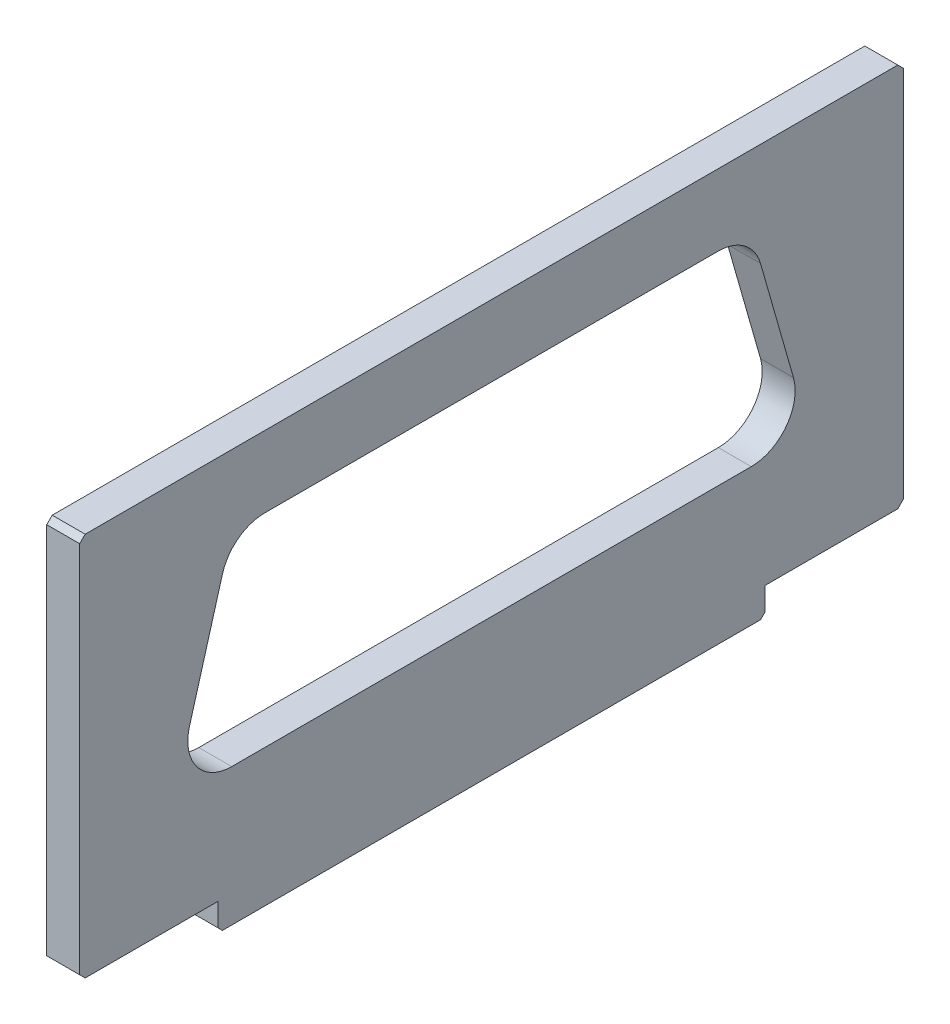
ISO-10303-21;
HEADER;
FILE_DESCRIPTION(('STEP AP214'),'2;1');
FILE_NAME('part.step','',(''),(''),'','','');
FILE_SCHEMA(('AUTOMOTIVE_DESIGN { 1 0 10303 214 1 1 1 1 }'));
ENDSEC;
DATA;
#1=APPLICATION_CONTEXT('core data for automotive mechanical design processes');
#2=APPLICATION_PROTOCOL_DEFINITION('international standard','automotive_design',2000,#1);
#3=PRODUCT_CONTEXT('',#1,'mechanical');
#4=PRODUCT('Part','Part','',(#3));
#5=PRODUCT_RELATED_PRODUCT_CATEGORY('part','',(#4));
#6=PRODUCT_DEFINITION_FORMATION('','',#4);
#7=PRODUCT_DEFINITION_CONTEXT('part definition',#1,'design');
#8=PRODUCT_DEFINITION('design','',#6,#7);
#9=PRODUCT_DEFINITION_SHAPE('','',#8);
#10=(LENGTH_UNIT() NAMED_UNIT(*) SI_UNIT(.MILLI.,.METRE.));
#11=(NAMED_UNIT(*) PLANE_ANGLE_UNIT() SI_UNIT($,.RADIAN.));
#12=(NAMED_UNIT(*) SI_UNIT($,.STERADIAN.) SOLID_ANGLE_UNIT());
#13=UNCERTAINTY_MEASURE_WITH_UNIT(LENGTH_MEASURE(1.E-05),#10,'distance_accuracy_value','');
#14=(GEOMETRIC_REPRESENTATION_CONTEXT(3) GLOBAL_UNCERTAINTY_ASSIGNED_CONTEXT((#13)) GLOBAL_UNIT_ASSIGNED_CONTEXT((#10,
#11,#12)) REPRESENTATION_CONTEXT('',''));
#15=CARTESIAN_POINT('',(0.,0.,0.));
#16=DIRECTION('',(0.,0.,1.));
#17=DIRECTION('',(1.,0.,0.));
#18=AXIS2_PLACEMENT_3D('',#15,#16,#17);
#19=CARTESIAN_POINT('',(78.7009618943231,-37.5,-139.21406460551));
#20=DIRECTION('',(0.,0.,1.));
#21=DIRECTION('',(1.,0.,0.));
#22=AXIS2_PLACEMENT_3D('',#19,#20,#21);
#23=PLANE('',#22);
#24=DIRECTION('',(0.,1.,0.));
#25=VECTOR('',#24,1.);
#26=CARTESIAN_POINT('',(81.7009618943231,-37.5,-139.21406460551));
#27=LINE('',#26,#25);
#28=CARTESIAN_POINT('',(81.7009618943231,-37.1,-139.21406460551));
#29=VERTEX_POINT('',#28);
#30=CARTESIAN_POINT('',(81.7009618943211,-35.,-139.21406460551));
#31=VERTEX_POINT('',#30);
#32=EDGE_CURVE('E377',#29,#31,#27,.T.);
#33=ORIENTED_EDGE('',*,*,#32,.F.);
#34=DIRECTION('',(-1.,0.,0.));
#35=VECTOR('',#34,1.);
#36=CARTESIAN_POINT('',(80.2009618943232,-37.1,-139.21406460551));
#37=LINE('',#36,#35);
#38=CARTESIAN_POINT('',(78.7009618943231,-37.1,-139.21406460551));
#39=VERTEX_POINT('',#38);
#40=EDGE_CURVE('E352',#29,#39,#37,.T.);
#41=ORIENTED_EDGE('',*,*,#40,.T.);
#42=DIRECTION('',(0.,1.,0.));
#43=VECTOR('',#42,1.);
#44=CARTESIAN_POINT('',(78.7009618943231,-37.5,-139.21406460551));
#45=LINE('',#44,#43);
#46=CARTESIAN_POINT('',(78.7009618943225,-35.,-139.21406460551));
#47=VERTEX_POINT('',#46);
#48=EDGE_CURVE('E308',#39,#47,#45,.T.);
#49=ORIENTED_EDGE('',*,*,#48,.T.);
#50=DIRECTION('',(1.,0.,0.));
#51=VECTOR('',#50,1.);
#52=CARTESIAN_POINT('',(78.7009618943231,-35.,-139.21406460551));
#53=LINE('',#52,#51);
#54=EDGE_CURVE('E284',#47,#31,#53,.T.);
#55=ORIENTED_EDGE('',*,*,#54,.T.);
#56=EDGE_LOOP('',(#33,#41,#49,#55));
#57=FACE_BOUND('',#56,.T.);
#58=ADVANCED_FACE('F40',(#57),#23,.F.);
#59=CARTESIAN_POINT('',(81.7009618943231,-37.5,-139.31406460551));
#60=DIRECTION('',(-1.,0.,0.));
#61=DIRECTION('',(0.,0.,1.));
#62=AXIS2_PLACEMENT_3D('',#59,#60,#61);
#63=PLANE('',#62);
#64=DIRECTION('',(0.,0.,1.));
#65=VECTOR('',#64,1.);
#66=CARTESIAN_POINT('',(81.7009618943217,-6.49999999999999,-93.6601603960729));
#67=LINE('',#66,#65);
#68=CARTESIAN_POINT('',(81.7009618943231,-6.49999999999999,-134.967968814943));
#69=VERTEX_POINT('',#68);
#70=CARTESIAN_POINT('',(81.7009618943217,-6.49999999999999,-93.6601603960729));
#71=VERTEX_POINT('',#70);
#72=EDGE_CURVE('E217',#69,#71,#67,.T.);
#73=ORIENTED_EDGE('',*,*,#72,.F.);
#74=CARTESIAN_POINT('',(81.7009618943212,-10.5,-134.967968814946));
#75=DIRECTION('',(1.,0.,0.));
#76=DIRECTION('',(0.,0.,1.));
#77=AXIS2_PLACEMENT_3D('',#74,#75,#76);
#78=CIRCLE('',#77,3.99999999999999);
#79=CARTESIAN_POINT('',(81.7009618943211,-9.40111548841048,-138.81406460551));
#80=VERTEX_POINT('',#79);
#81=EDGE_CURVE('E58',#80,#69,#78,.T.);
#82=ORIENTED_EDGE('',*,*,#81,.F.);
#83=DIRECTION('',(0.,0.961523947640823,0.274721127897377));
#84=VECTOR('',#83,1.);
#85=CARTESIAN_POINT('',(81.7009618943211,-9.40111548841048,-138.81406460551));
#86=LINE('',#85,#84);
#87=CARTESIAN_POINT('',(81.7009618943211,-19.9011154884105,-141.81406460551));
#88=VERTEX_POINT('',#87);
#89=EDGE_CURVE('E205',#88,#80,#86,.T.);
#90=ORIENTED_EDGE('',*,*,#89,.F.);
#91=CARTESIAN_POINT('',(81.7009618943211,-21.,-137.967968814946));
#92=DIRECTION('',(1.,0.,0.));
#93=DIRECTION('',(0.,0.,-1.));
#94=AXIS2_PLACEMENT_3D('',#91,#92,#93);
#95=CIRCLE('',#94,3.99999999999998);
#96=CARTESIAN_POINT('',(81.7009618943211,-25.,-137.967968814946));
#97=VERTEX_POINT('',#96);
#98=EDGE_CURVE('E241',#97,#88,#95,.T.);
#99=ORIENTED_EDGE('',*,*,#98,.F.);
#100=DIRECTION('',(0.,0.,-1.));
#101=VECTOR('',#100,1.);
#102=CARTESIAN_POINT('',(81.7009618943217,-25.,-90.6601603960729));
#103=LINE('',#102,#101);
#104=CARTESIAN_POINT('',(81.7009618943217,-25.,-90.6601603960729));
#105=VERTEX_POINT('',#104);
#106=EDGE_CURVE('E237',#105,#97,#103,.T.);
#107=ORIENTED_EDGE('',*,*,#106,.F.);
#108=CARTESIAN_POINT('',(81.7009618943217,-21.,-90.6601603960729));
#109=DIRECTION('',(1.,0.,0.));
#110=DIRECTION('',(0.,0.,-1.));
#111=AXIS2_PLACEMENT_3D('',#108,#109,#110);
#112=CIRCLE('',#111,4.);
#113=CARTESIAN_POINT('',(81.7009618943218,-19.9011154884105,-86.8140646055096));
#114=VERTEX_POINT('',#113);
#115=EDGE_CURVE('E233',#114,#105,#112,.T.);
#116=ORIENTED_EDGE('',*,*,#115,.F.);
#117=DIRECTION('',(0.,-0.961523947640823,0.274721127897378));
#118=VECTOR('',#117,1.);
#119=CARTESIAN_POINT('',(81.7009618943217,-9.40111548841048,-89.8140646055096));
#120=LINE('',#119,#118);
#121=CARTESIAN_POINT('',(81.7009618943217,-9.40111548841048,-89.8140646055096));
#122=VERTEX_POINT('',#121);
#123=EDGE_CURVE('E229',#122,#114,#120,.T.);
#124=ORIENTED_EDGE('',*,*,#123,.F.);
#125=CARTESIAN_POINT('',(81.7009618943217,-10.5,-93.6601603960729));
#126=DIRECTION('',(1.,0.,0.));
#127=DIRECTION('',(0.,0.,-1.));
#128=AXIS2_PLACEMENT_3D('',#125,#126,#127);
#129=CIRCLE('',#128,4.);
#130=EDGE_CURVE('E225',#71,#122,#129,.T.);
#131=ORIENTED_EDGE('',*,*,#130,.F.);
#132=EDGE_LOOP('',(#73,#82,#90,#99,#107,#116,#124,#131));
#133=FACE_BOUND('',#132,.T.);
#134=DIRECTION('',(0.,1.,0.));
#135=VECTOR('',#134,1.);
#136=CARTESIAN_POINT('',(81.7009618943231,-37.5,-89.4140646055097));
#137=LINE('',#136,#135);
#138=CARTESIAN_POINT('',(81.7009618943231,-37.1,-89.4140646055097));
#139=VERTEX_POINT('',#138);
#140=CARTESIAN_POINT('',(81.7009618943217,-35.,-89.4140646055097));
#141=VERTEX_POINT('',#140);
#142=EDGE_CURVE('E380',#139,#141,#137,.T.);
#143=ORIENTED_EDGE('',*,*,#142,.F.);
#144=DIRECTION('',(0.,0.707106781186546,0.707106781186549));
#145=VECTOR('',#144,1.);
#146=CARTESIAN_POINT('',(81.7009618943231,-37.,-89.3140646055097));
#147=LINE('',#146,#145);
#148=CARTESIAN_POINT('',(81.7009618943231,-37.5,-89.8140646055098));
#149=VERTEX_POINT('',#148);
#150=EDGE_CURVE('E324',#139,#149,#147,.F.);
#151=ORIENTED_EDGE('',*,*,#150,.T.);
#152=DIRECTION('',(0.,0.,1.));
#153=VECTOR('',#152,1.);
#154=CARTESIAN_POINT('',(81.7009618943231,-37.5,-139.31406460551));
#155=LINE('',#154,#153);
#156=CARTESIAN_POINT('',(81.7009618943231,-37.5,-138.81406460551));
#157=VERTEX_POINT('',#156);
#158=EDGE_CURVE('E299',#157,#149,#155,.T.);
#159=ORIENTED_EDGE('',*,*,#158,.F.);
#160=DIRECTION('',(0.,0.707106781186559,-0.707106781186536));
#161=VECTOR('',#160,1.);
#162=CARTESIAN_POINT('',(81.7009618943231,-37.5,-138.81406460551));
#163=LINE('',#162,#161);
#164=EDGE_CURVE('E321',#157,#29,#163,.T.);
#165=ORIENTED_EDGE('',*,*,#164,.T.);
#166=ORIENTED_EDGE('',*,*,#32,.T.);
#167=DIRECTION('',(0.,0.,-1.));
#168=VECTOR('',#167,1.);
#169=CARTESIAN_POINT('',(81.7009618943219,-35.,-76.8140646055096));
#170=LINE('',#169,#168);
#171=CARTESIAN_POINT('',(81.700961894321,-35.,-151.31406460551));
#172=VERTEX_POINT('',#171);
#173=EDGE_CURVE('E288',#31,#172,#170,.T.);
#174=ORIENTED_EDGE('',*,*,#173,.T.);
#175=DIRECTION('',(0.,-0.707106781186563,0.707106781186531));
#176=VECTOR('',#175,1.);
#177=CARTESIAN_POINT('',(81.7009618943231,-35.,-151.31406460551));
#178=LINE('',#177,#176);
#179=CARTESIAN_POINT('',(81.700961894321,-34.5,-151.81406460551));
#180=VERTEX_POINT('',#179);
#181=EDGE_CURVE('E315',#172,#180,#178,.F.);
#182=ORIENTED_EDGE('',*,*,#181,.T.);
#183=DIRECTION('',(0.,1.,0.));
#184=VECTOR('',#183,1.);
#185=CARTESIAN_POINT('',(81.700961894321,-35.,-151.81406460551));
#186=LINE('',#185,#184);
#187=CARTESIAN_POINT('',(81.700961894321,-0.5,-151.81406460551));
#188=VERTEX_POINT('',#187);
#189=EDGE_CURVE('E292',#180,#188,#186,.T.);
#190=ORIENTED_EDGE('',*,*,#189,.T.);
#191=DIRECTION('',(0.,-0.707106781186553,-0.707106781186542));
#192=VECTOR('',#191,1.);
#193=CARTESIAN_POINT('',(81.7009618943231,-0.499999999999982,-151.81406460551));
#194=LINE('',#193,#192);
#195=CARTESIAN_POINT('',(81.700961894321,0.,-151.31406460551));
#196=VERTEX_POINT('',#195);
#197=EDGE_CURVE('E318',#188,#196,#194,.F.);
#198=ORIENTED_EDGE('',*,*,#197,.T.);
#199=DIRECTION('',(0.,0.,1.));
#200=VECTOR('',#199,1.);
#201=CARTESIAN_POINT('',(81.7009618943219,0.,-76.8140646055096));
#202=LINE('',#201,#200);
#203=CARTESIAN_POINT('',(81.7009618943218,0.,-77.3140646055096));
#204=VERTEX_POINT('',#203);
#205=EDGE_CURVE('E272',#196,#204,#202,.T.);
#206=ORIENTED_EDGE('',*,*,#205,.T.);
#207=DIRECTION('',(0.,0.707106781186549,-0.707106781186546));
#208=VECTOR('',#207,1.);
#209=CARTESIAN_POINT('',(81.7009618943231,0.,-77.3140646055095));
#210=LINE('',#209,#208);
#211=CARTESIAN_POINT('',(81.7009618943219,-0.5,-76.8140646055096));
#212=VERTEX_POINT('',#211);
#213=EDGE_CURVE('E309',#204,#212,#210,.F.);
#214=ORIENTED_EDGE('',*,*,#213,.T.);
#215=DIRECTION('',(0.,-1.,0.));
#216=VECTOR('',#215,1.);
#217=CARTESIAN_POINT('',(81.7009618943219,-35.,-76.8140646055096));
#218=LINE('',#217,#216);
#219=CARTESIAN_POINT('',(81.7009618943219,-34.5,-76.8140646055096));
#220=VERTEX_POINT('',#219);
#221=EDGE_CURVE('E198',#212,#220,#218,.T.);
#222=ORIENTED_EDGE('',*,*,#221,.T.);
#223=DIRECTION('',(0.,0.707106781186545,0.70710678118655));
#224=VECTOR('',#223,1.);
#225=CARTESIAN_POINT('',(81.7009618943231,-34.5,-76.8140646055095));
#226=LINE('',#225,#224);
#227=CARTESIAN_POINT('',(81.7009618943218,-35.,-77.3140646055095));
#228=VERTEX_POINT('',#227);
#229=EDGE_CURVE('E312',#220,#228,#226,.F.);
#230=ORIENTED_EDGE('',*,*,#229,.T.);
#231=EDGE_CURVE('E289',#228,#141,#170,.T.);
#232=ORIENTED_EDGE('',*,*,#231,.T.);
#233=EDGE_LOOP('',(#143,#151,#159,#165,#166,#174,#182,#190,#198,#206,#214,#222,#230,#232));
#234=FACE_BOUND('',#233,.T.);
#235=ADVANCED_FACE('F441',(#133,#234),#63,.F.);
#236=CARTESIAN_POINT('',(78.7009618943231,-37.5,-89.4140646055097));
#237=DIRECTION('',(0.,0.,1.));
#238=DIRECTION('',(1.,0.,0.));
#239=AXIS2_PLACEMENT_3D('',#236,#237,#238);
#240=PLANE('',#239);
#241=DIRECTION('',(0.,1.,0.));
#242=VECTOR('',#241,1.);
#243=CARTESIAN_POINT('',(78.7009618943231,-37.5,-89.4140646055097));
#244=LINE('',#243,#242);
#245=CARTESIAN_POINT('',(78.7009618943231,-37.1,-89.4140646055097));
#246=VERTEX_POINT('',#245);
#247=CARTESIAN_POINT('',(78.7009618943231,-35.,-89.4140646055097));
#248=VERTEX_POINT('',#247);
#249=EDGE_CURVE('E386',#246,#248,#244,.T.);
#250=ORIENTED_EDGE('',*,*,#249,.F.);
#251=DIRECTION('',(-1.,0.,0.));
#252=VECTOR('',#251,1.);
#253=CARTESIAN_POINT('',(78.7009618943231,-37.1,-89.4140646055097));
#254=LINE('',#253,#252);
#255=EDGE_CURVE('E44',#246,#139,#254,.F.);
#256=ORIENTED_EDGE('',*,*,#255,.T.);
#257=ORIENTED_EDGE('',*,*,#142,.T.);
#258=DIRECTION('',(1.,0.,0.));
#259=VECTOR('',#258,1.);
#260=CARTESIAN_POINT('',(78.7009618943231,-35.,-89.4140646055097));
#261=LINE('',#260,#259);
#262=EDGE_CURVE('E304',#248,#141,#261,.T.);
#263=ORIENTED_EDGE('',*,*,#262,.F.);
#264=EDGE_LOOP('',(#250,#256,#257,#263));
#265=FACE_BOUND('',#264,.T.);
#266=ADVANCED_FACE('F42',(#265),#240,.T.);
#267=CARTESIAN_POINT('',(78.7009618943231,-37.5,-139.31406460551));
#268=DIRECTION('',(-1.,0.,0.));
#269=DIRECTION('',(0.,0.,1.));
#270=AXIS2_PLACEMENT_3D('',#267,#268,#269);
#271=PLANE('',#270);
#272=CARTESIAN_POINT('',(78.7009618943231,-10.5,-134.967968814946));
#273=DIRECTION('',(-1.,0.,0.));
#274=DIRECTION('',(0.,0.,1.));
#275=AXIS2_PLACEMENT_3D('',#272,#273,#274);
#276=CIRCLE('',#275,3.99999999999999);
#277=CARTESIAN_POINT('',(78.7009618943231,-9.40111548841048,-138.81406460551));
#278=VERTEX_POINT('',#277);
#279=CARTESIAN_POINT('',(78.7009618943231,-6.49999999999999,-134.967968814946));
#280=VERTEX_POINT('',#279);
#281=EDGE_CURVE('E202',#278,#280,#276,.F.);
#282=ORIENTED_EDGE('',*,*,#281,.T.);
#283=DIRECTION('',(0.,0.,1.));
#284=VECTOR('',#283,1.);
#285=CARTESIAN_POINT('',(78.7009618943231,-6.49999999999999,-93.6601603960724));
#286=LINE('',#285,#284);
#287=CARTESIAN_POINT('',(78.7009618943231,-6.49999999999999,-93.6601603960728));
#288=VERTEX_POINT('',#287);
#289=EDGE_CURVE('E190',#280,#288,#286,.T.);
#290=ORIENTED_EDGE('',*,*,#289,.T.);
#291=CARTESIAN_POINT('',(78.7009618943231,-10.5,-93.6601603960728));
#292=DIRECTION('',(-1.,0.,0.));
#293=DIRECTION('',(0.,0.,1.));
#294=AXIS2_PLACEMENT_3D('',#291,#292,#293);
#295=CIRCLE('',#294,4.);
#296=CARTESIAN_POINT('',(78.7009618943231,-9.40111548841048,-89.8140646055095));
#297=VERTEX_POINT('',#296);
#298=EDGE_CURVE('E612',#288,#297,#295,.F.);
#299=ORIENTED_EDGE('',*,*,#298,.T.);
#300=DIRECTION('',(0.,-0.961523947640823,0.274721127897378));
#301=VECTOR('',#300,1.);
#302=CARTESIAN_POINT('',(78.7009618943231,-9.40111548841058,-89.8140646055095));
#303=LINE('',#302,#301);
#304=CARTESIAN_POINT('',(78.7009618943231,-19.9011154884105,-86.8140646055095));
#305=VERTEX_POINT('',#304);
#306=EDGE_CURVE('E615',#297,#305,#303,.T.);
#307=ORIENTED_EDGE('',*,*,#306,.T.);
#308=CARTESIAN_POINT('',(78.7009618943231,-21.,-90.6601603960728));
#309=DIRECTION('',(-1.,0.,0.));
#310=DIRECTION('',(0.,0.,1.));
#311=AXIS2_PLACEMENT_3D('',#308,#309,#310);
#312=CIRCLE('',#311,4.);
#313=CARTESIAN_POINT('',(78.7009618943231,-25.,-90.6601603960728));
#314=VERTEX_POINT('',#313);
#315=EDGE_CURVE('E619',#305,#314,#312,.F.);
#316=ORIENTED_EDGE('',*,*,#315,.T.);
#317=DIRECTION('',(0.,0.,-1.));
#318=VECTOR('',#317,1.);
#319=CARTESIAN_POINT('',(78.7009618943231,-25.,-90.6601603960724));
#320=LINE('',#319,#318);
#321=CARTESIAN_POINT('',(78.7009618943231,-25.,-137.967968814946));
#322=VERTEX_POINT('',#321);
#323=EDGE_CURVE('E625',#314,#322,#320,.T.);
#324=ORIENTED_EDGE('',*,*,#323,.T.);
#325=CARTESIAN_POINT('',(78.7009618943231,-21.,-137.967968814946));
#326=DIRECTION('',(-1.,0.,0.));
#327=DIRECTION('',(0.,0.,1.));
#328=AXIS2_PLACEMENT_3D('',#325,#326,#327);
#329=CIRCLE('',#328,3.99999999999998);
#330=CARTESIAN_POINT('',(78.7009618943231,-19.9011154884105,-141.81406460551));
#331=VERTEX_POINT('',#330);
#332=EDGE_CURVE('E219',#322,#331,#329,.F.);
#333=ORIENTED_EDGE('',*,*,#332,.T.);
#334=DIRECTION('',(0.,0.961523947640823,0.274721127897377));
#335=VECTOR('',#334,1.);
#336=CARTESIAN_POINT('',(78.7009618943231,-9.40111548841037,-138.81406460551));
#337=LINE('',#336,#335);
#338=EDGE_CURVE('E211',#331,#278,#337,.T.);
#339=ORIENTED_EDGE('',*,*,#338,.T.);
#340=EDGE_LOOP('',(#282,#290,#299,#307,#316,#324,#333,#339));
#341=FACE_BOUND('',#340,.T.);
#342=DIRECTION('',(0.,0.,1.));
#343=VECTOR('',#342,1.);
#344=CARTESIAN_POINT('',(78.7009618943231,-37.5,-139.31406460551));
#345=LINE('',#344,#343);
#346=CARTESIAN_POINT('',(78.7009618943231,-37.5,-138.81406460551));
#347=VERTEX_POINT('',#346);
#348=CARTESIAN_POINT('',(78.7009618943231,-37.5,-89.8140646055097));
#349=VERTEX_POINT('',#348);
#350=EDGE_CURVE('E303',#347,#349,#345,.T.);
#351=ORIENTED_EDGE('',*,*,#350,.T.);
#352=DIRECTION('',(0.,-0.707106781186546,-0.707106781186549));
#353=VECTOR('',#352,1.);
#354=CARTESIAN_POINT('',(78.7009618943231,-62.25,-114.56406460551));
#355=LINE('',#354,#353);
#356=EDGE_CURVE('E349',#349,#246,#355,.F.);
#357=ORIENTED_EDGE('',*,*,#356,.T.);
#358=ORIENTED_EDGE('',*,*,#249,.T.);
#359=DIRECTION('',(0.,0.,-1.));
#360=VECTOR('',#359,1.);
#361=CARTESIAN_POINT('',(78.7009618943233,-35.,-76.8140646055095));
#362=LINE('',#361,#360);
#363=CARTESIAN_POINT('',(78.7009618943233,-35.,-77.3140646055095));
#364=VERTEX_POINT('',#363);
#365=EDGE_CURVE('E273',#364,#248,#362,.T.);
#366=ORIENTED_EDGE('',*,*,#365,.F.);
#367=DIRECTION('',(0.,-0.707106781186545,-0.70710678118655));
#368=VECTOR('',#367,1.);
#369=CARTESIAN_POINT('',(78.7009618943231,-67.2500000000001,-109.56406460551));
#370=LINE('',#369,#368);
#371=CARTESIAN_POINT('',(78.7009618943233,-34.5,-76.8140646055095));
#372=VERTEX_POINT('',#371);
#373=EDGE_CURVE('E337',#364,#372,#370,.F.);
#374=ORIENTED_EDGE('',*,*,#373,.T.);
#375=DIRECTION('',(0.,-1.,0.));
#376=VECTOR('',#375,1.);
#377=CARTESIAN_POINT('',(78.7009618943233,-35.,-76.8140646055095));
#378=LINE('',#377,#376);
#379=CARTESIAN_POINT('',(78.7009618943233,-0.5,-76.8140646055095));
#380=VERTEX_POINT('',#379);
#381=EDGE_CURVE('E267',#380,#372,#378,.T.);
#382=ORIENTED_EDGE('',*,*,#381,.F.);
#383=DIRECTION('',(0.,-0.707106781186549,0.707106781186546));
#384=VECTOR('',#383,1.);
#385=CARTESIAN_POINT('',(78.7009618943231,12.25,-89.5640646055095));
#386=LINE('',#385,#384);
#387=CARTESIAN_POINT('',(78.7009618943233,0.,-77.3140646055095));
#388=VERTEX_POINT('',#387);
#389=EDGE_CURVE('E334',#380,#388,#386,.F.);
#390=ORIENTED_EDGE('',*,*,#389,.T.);
#391=DIRECTION('',(0.,0.,1.));
#392=VECTOR('',#391,1.);
#393=CARTESIAN_POINT('',(78.7009618943233,0.,-76.8140646055095));
#394=LINE('',#393,#392);
#395=CARTESIAN_POINT('',(78.7009618943224,0.,-151.31406460551));
#396=VERTEX_POINT('',#395);
#397=EDGE_CURVE('E280',#396,#388,#394,.T.);
#398=ORIENTED_EDGE('',*,*,#397,.F.);
#399=DIRECTION('',(0.,0.707106781186553,0.707106781186542));
#400=VECTOR('',#399,1.);
#401=CARTESIAN_POINT('',(78.7009618943231,-12.7500000000004,-164.06406460551));
#402=LINE('',#401,#400);
#403=CARTESIAN_POINT('',(78.7009618943224,-0.5,-151.81406460551));
#404=VERTEX_POINT('',#403);
#405=EDGE_CURVE('E343',#396,#404,#402,.F.);
#406=ORIENTED_EDGE('',*,*,#405,.T.);
#407=DIRECTION('',(0.,1.,0.));
#408=VECTOR('',#407,1.);
#409=CARTESIAN_POINT('',(78.7009618943224,-35.,-151.81406460551));
#410=LINE('',#409,#408);
#411=CARTESIAN_POINT('',(78.7009618943224,-34.5,-151.81406460551));
#412=VERTEX_POINT('',#411);
#413=EDGE_CURVE('E276',#412,#404,#410,.T.);
#414=ORIENTED_EDGE('',*,*,#413,.F.);
#415=DIRECTION('',(0.,0.707106781186563,-0.707106781186532));
#416=VECTOR('',#415,1.);
#417=CARTESIAN_POINT('',(78.7009618943231,-42.25,-144.06406460551));
#418=LINE('',#417,#416);
#419=CARTESIAN_POINT('',(78.7009618943224,-35.,-151.31406460551));
#420=VERTEX_POINT('',#419);
#421=EDGE_CURVE('E340',#412,#420,#418,.F.);
#422=ORIENTED_EDGE('',*,*,#421,.T.);
#423=EDGE_CURVE('E271',#47,#420,#362,.T.);
#424=ORIENTED_EDGE('',*,*,#423,.F.);
#425=ORIENTED_EDGE('',*,*,#48,.F.);
#426=DIRECTION('',(0.,-0.707106781186559,0.707106781186536));
#427=VECTOR('',#426,1.);
#428=CARTESIAN_POINT('',(78.7009618943231,-37.25,-139.06406460551));
#429=LINE('',#428,#427);
#430=EDGE_CURVE('E346',#39,#347,#429,.T.);
#431=ORIENTED_EDGE('',*,*,#430,.T.);
#432=EDGE_LOOP('',(#351,#357,#358,#366,#374,#382,#390,#398,#406,#414,#422,#424,#425,#431));
#433=FACE_BOUND('',#432,.T.);
#434=ADVANCED_FACE('F208',(#341,#433),#271,.T.);
#435=CARTESIAN_POINT('',(80.2009618943231,-37.5,20.6859353944898));
#436=DIRECTION('',(0.,-1.,0.));
#437=DIRECTION('',(-0.5,0.,-0.866025403784439));
#438=AXIS2_PLACEMENT_3D('',#435,#436,#437);
#439=PLANE('',#438);
#440=ORIENTED_EDGE('',*,*,#158,.T.);
#441=DIRECTION('',(-1.,0.,0.));
#442=VECTOR('',#441,1.);
#443=CARTESIAN_POINT('',(80.200961894323,-37.5,-89.8140646055097));
#444=LINE('',#443,#442);
#445=EDGE_CURVE('E331',#149,#349,#444,.T.);
#446=ORIENTED_EDGE('',*,*,#445,.T.);
#447=ORIENTED_EDGE('',*,*,#350,.F.);
#448=DIRECTION('',(1.,0.,0.));
#449=VECTOR('',#448,1.);
#450=CARTESIAN_POINT('',(81.7009618943231,-37.5,-138.81406460551));
#451=LINE('',#450,#449);
#452=EDGE_CURVE('E327',#347,#157,#451,.T.);
#453=ORIENTED_EDGE('',*,*,#452,.T.);
#454=EDGE_LOOP('',(#440,#446,#447,#453));
#455=FACE_BOUND('',#454,.T.);
#456=ADVANCED_FACE('F443',(#455),#439,.T.);
#457=CARTESIAN_POINT('',(78.7009618943233,-35.,-76.8140646055095));
#458=DIRECTION('',(0.,-1.,0.));
#459=DIRECTION('',(-0.5,0.,-0.866025403784439));
#460=AXIS2_PLACEMENT_3D('',#457,#458,#459);
#461=PLANE('',#460);
#462=ORIENTED_EDGE('',*,*,#423,.T.);
#463=DIRECTION('',(1.,0.,0.));
#464=VECTOR('',#463,1.);
#465=CARTESIAN_POINT('',(78.7009618943224,-35.,-151.31406460551));
#466=LINE('',#465,#464);
#467=EDGE_CURVE('E367',#420,#172,#466,.T.);
#468=ORIENTED_EDGE('',*,*,#467,.T.);
#469=ORIENTED_EDGE('',*,*,#173,.F.);
#470=ORIENTED_EDGE('',*,*,#54,.F.);
#471=EDGE_LOOP('',(#462,#468,#469,#470));
#472=FACE_BOUND('',#471,.T.);
#473=ADVANCED_FACE('F459',(#472),#461,.T.);
#474=CARTESIAN_POINT('',(78.7009618943233,-35.,-76.8140646055095));
#475=DIRECTION('',(0.,0.,1.));
#476=DIRECTION('',(1.,0.,0.));
#477=AXIS2_PLACEMENT_3D('',#474,#475,#476);
#478=PLANE('',#477);
#479=ORIENTED_EDGE('',*,*,#381,.T.);
#480=DIRECTION('',(1.,0.,0.));
#481=VECTOR('',#480,1.);
#482=CARTESIAN_POINT('',(78.7009618943233,-34.5,-76.8140646055095));
#483=LINE('',#482,#481);
#484=EDGE_CURVE('E50',#372,#220,#483,.T.);
#485=ORIENTED_EDGE('',*,*,#484,.T.);
#486=ORIENTED_EDGE('',*,*,#221,.F.);
#487=DIRECTION('',(-1.,0.,0.));
#488=VECTOR('',#487,1.);
#489=CARTESIAN_POINT('',(78.7009618943233,-0.5,-76.8140646055095));
#490=LINE('',#489,#488);
#491=EDGE_CURVE('E371',#212,#380,#490,.T.);
#492=ORIENTED_EDGE('',*,*,#491,.T.);
#493=EDGE_LOOP('',(#479,#485,#486,#492));
#494=FACE_BOUND('',#493,.T.);
#495=ADVANCED_FACE('F520',(#494),#478,.T.);
#496=CARTESIAN_POINT('',(78.7009618943233,0.,-76.8140646055095));
#497=DIRECTION('',(0.,1.,0.));
#498=DIRECTION('',(0.5,0.,0.866025403784439));
#499=AXIS2_PLACEMENT_3D('',#496,#497,#498);
#500=PLANE('',#499);
#501=ORIENTED_EDGE('',*,*,#205,.F.);
#502=DIRECTION('',(-1.,0.,0.));
#503=VECTOR('',#502,1.);
#504=CARTESIAN_POINT('',(78.7009618943224,0.,-151.31406460551));
#505=LINE('',#504,#503);
#506=EDGE_CURVE('E364',#196,#396,#505,.T.);
#507=ORIENTED_EDGE('',*,*,#506,.T.);
#508=ORIENTED_EDGE('',*,*,#397,.T.);
#509=DIRECTION('',(1.,0.,0.));
#510=VECTOR('',#509,1.);
#511=CARTESIAN_POINT('',(78.7009618943233,0.,-77.3140646055095));
#512=LINE('',#511,#510);
#513=EDGE_CURVE('E360',#388,#204,#512,.T.);
#514=ORIENTED_EDGE('',*,*,#513,.T.);
#515=EDGE_LOOP('',(#501,#507,#508,#514));
#516=FACE_BOUND('',#515,.T.);
#517=ADVANCED_FACE('F511',(#516),#500,.T.);
#518=CARTESIAN_POINT('',(78.7009618943224,-35.,-151.81406460551));
#519=DIRECTION('',(0.,0.,-1.));
#520=DIRECTION('',(-1.,0.,0.));
#521=AXIS2_PLACEMENT_3D('',#518,#519,#520);
#522=PLANE('',#521);
#523=ORIENTED_EDGE('',*,*,#413,.T.);
#524=DIRECTION('',(1.,0.,0.));
#525=VECTOR('',#524,1.);
#526=CARTESIAN_POINT('',(78.7009618943224,-0.5,-151.81406460551));
#527=LINE('',#526,#525);
#528=EDGE_CURVE('E356',#404,#188,#527,.T.);
#529=ORIENTED_EDGE('',*,*,#528,.T.);
#530=ORIENTED_EDGE('',*,*,#189,.F.);
#531=DIRECTION('',(-1.,0.,0.));
#532=VECTOR('',#531,1.);
#533=CARTESIAN_POINT('',(78.7009618943224,-34.5,-151.81406460551));
#534=LINE('',#533,#532);
#535=EDGE_CURVE('E353',#180,#412,#534,.T.);
#536=ORIENTED_EDGE('',*,*,#535,.T.);
#537=EDGE_LOOP('',(#523,#529,#530,#536));
#538=FACE_BOUND('',#537,.T.);
#539=ADVANCED_FACE('F502',(#538),#522,.T.);
#540=ORIENTED_EDGE('',*,*,#231,.F.);
#541=DIRECTION('',(-1.,0.,0.));
#542=VECTOR('',#541,1.);
#543=CARTESIAN_POINT('',(78.7009618943233,-35.,-77.3140646055095));
#544=LINE('',#543,#542);
#545=EDGE_CURVE('E12',#228,#364,#544,.T.);
#546=ORIENTED_EDGE('',*,*,#545,.T.);
#547=ORIENTED_EDGE('',*,*,#365,.T.);
#548=ORIENTED_EDGE('',*,*,#262,.T.);
#549=EDGE_LOOP('',(#540,#546,#547,#548));
#550=FACE_BOUND('',#549,.T.);
#551=ADVANCED_FACE('F406',(#550),#461,.T.);
#552=CARTESIAN_POINT('',(78.7009618943231,-37.,-89.3140646055097));
#553=DIRECTION('',(0.,0.707106781186549,-0.707106781186546));
#554=DIRECTION('',(1.,0.,0.));
#555=AXIS2_PLACEMENT_3D('',#552,#553,#554);
#556=PLANE('',#555);
#557=ORIENTED_EDGE('',*,*,#356,.F.);
#558=ORIENTED_EDGE('',*,*,#445,.F.);
#559=ORIENTED_EDGE('',*,*,#150,.F.);
#560=ORIENTED_EDGE('',*,*,#255,.F.);
#561=EDGE_LOOP('',(#557,#558,#559,#560));
#562=FACE_BOUND('',#561,.T.);
#563=ADVANCED_FACE('F412',(#562),#556,.F.);
#564=CARTESIAN_POINT('',(80.2009618943232,-37.5,-138.81406460551));
#565=DIRECTION('',(0.,-0.707106781186536,-0.707106781186559));
#566=DIRECTION('',(-1.,0.,0.));
#567=AXIS2_PLACEMENT_3D('',#564,#565,#566);
#568=PLANE('',#567);
#569=ORIENTED_EDGE('',*,*,#430,.F.);
#570=ORIENTED_EDGE('',*,*,#40,.F.);
#571=ORIENTED_EDGE('',*,*,#164,.F.);
#572=ORIENTED_EDGE('',*,*,#452,.F.);
#573=EDGE_LOOP('',(#569,#570,#571,#572));
#574=FACE_BOUND('',#573,.T.);
#575=ADVANCED_FACE('F448',(#574),#568,.T.);
#576=CARTESIAN_POINT('',(78.7009618943224,-0.5,-151.81406460551));
#577=DIRECTION('',(0.,-0.707106781186542,0.707106781186553));
#578=DIRECTION('',(1.,0.,0.));
#579=AXIS2_PLACEMENT_3D('',#576,#577,#578);
#580=PLANE('',#579);
#581=ORIENTED_EDGE('',*,*,#405,.F.);
#582=ORIENTED_EDGE('',*,*,#506,.F.);
#583=ORIENTED_EDGE('',*,*,#197,.F.);
#584=ORIENTED_EDGE('',*,*,#528,.F.);
#585=EDGE_LOOP('',(#581,#582,#583,#584));
#586=FACE_BOUND('',#585,.T.);
#587=ADVANCED_FACE('F507',(#586),#580,.F.);
#588=CARTESIAN_POINT('',(78.7009618943223,-35.,-151.31406460551));
#589=DIRECTION('',(0.,0.707106781186532,0.707106781186563));
#590=DIRECTION('',(1.,0.,0.));
#591=AXIS2_PLACEMENT_3D('',#588,#589,#590);
#592=PLANE('',#591);
#593=ORIENTED_EDGE('',*,*,#421,.F.);
#594=ORIENTED_EDGE('',*,*,#535,.F.);
#595=ORIENTED_EDGE('',*,*,#181,.F.);
#596=ORIENTED_EDGE('',*,*,#467,.F.);
#597=EDGE_LOOP('',(#593,#594,#595,#596));
#598=FACE_BOUND('',#597,.T.);
#599=ADVANCED_FACE('F498',(#598),#592,.F.);
#600=CARTESIAN_POINT('',(78.7009618943233,-34.5,-76.8140646055095));
#601=DIRECTION('',(0.,0.70710678118655,-0.707106781186545));
#602=DIRECTION('',(1.,0.,0.));
#603=AXIS2_PLACEMENT_3D('',#600,#601,#602);
#604=PLANE('',#603);
#605=ORIENTED_EDGE('',*,*,#373,.F.);
#606=ORIENTED_EDGE('',*,*,#545,.F.);
#607=ORIENTED_EDGE('',*,*,#229,.F.);
#608=ORIENTED_EDGE('',*,*,#484,.F.);
#609=EDGE_LOOP('',(#605,#606,#607,#608));
#610=FACE_BOUND('',#609,.T.);
#611=ADVANCED_FACE('F524',(#610),#604,.F.);
#612=CARTESIAN_POINT('',(78.7009618943233,0.,-77.3140646055095));
#613=DIRECTION('',(0.,-0.707106781186546,-0.707106781186549));
#614=DIRECTION('',(1.,0.,0.));
#615=AXIS2_PLACEMENT_3D('',#612,#613,#614);
#616=PLANE('',#615);
#617=ORIENTED_EDGE('',*,*,#389,.F.);
#618=ORIENTED_EDGE('',*,*,#491,.F.);
#619=ORIENTED_EDGE('',*,*,#213,.F.);
#620=ORIENTED_EDGE('',*,*,#513,.F.);
#621=EDGE_LOOP('',(#617,#618,#619,#620));
#622=FACE_BOUND('',#621,.T.);
#623=ADVANCED_FACE('F516',(#622),#616,.F.);
#624=CARTESIAN_POINT('',(46.2236432270028,-10.5,-134.967968814946));
#625=DIRECTION('',(1.,0.,0.));
#626=DIRECTION('',(0.,0.,-1.));
#627=AXIS2_PLACEMENT_3D('',#624,#625,#626);
#628=CYLINDRICAL_SURFACE('',#627,3.99999999999999);
#629=DIRECTION('',(1.,0.,0.));
#630=VECTOR('',#629,1.);
#631=CARTESIAN_POINT('',(46.2236432270027,-9.40111548841048,-138.814064605509));
#632=LINE('',#631,#630);
#633=EDGE_CURVE('E199',#278,#80,#632,.T.);
#634=ORIENTED_EDGE('',*,*,#633,.T.);
#635=ORIENTED_EDGE('',*,*,#81,.T.);
#636=DIRECTION('',(1.,0.,0.));
#637=VECTOR('',#636,1.);
#638=CARTESIAN_POINT('',(46.2236432270028,-6.49999999999999,-134.967968814946));
#639=LINE('',#638,#637);
#640=EDGE_CURVE('E192',#280,#69,#639,.T.);
#641=ORIENTED_EDGE('',*,*,#640,.F.);
#642=ORIENTED_EDGE('',*,*,#281,.F.);
#643=EDGE_LOOP('',(#634,#635,#641,#642));
#644=FACE_BOUND('',#643,.T.);
#645=ADVANCED_FACE('F201',(#644),#628,.F.);
#646=CARTESIAN_POINT('',(46.2236432270027,-9.40111548841048,-138.814064605509));
#647=DIRECTION('',(0.,0.274721127897377,-0.961523947640823));
#648=DIRECTION('',(-1.,0.,0.));
#649=AXIS2_PLACEMENT_3D('',#646,#647,#648);
#650=PLANE('',#649);
#651=DIRECTION('',(1.,0.,0.));
#652=VECTOR('',#651,1.);
#653=CARTESIAN_POINT('',(46.2236432270027,-19.9011154884105,-141.814064605509));
#654=LINE('',#653,#652);
#655=EDGE_CURVE('E250',#331,#88,#654,.T.);
#656=ORIENTED_EDGE('',*,*,#655,.T.);
#657=ORIENTED_EDGE('',*,*,#89,.T.);
#658=ORIENTED_EDGE('',*,*,#633,.F.);
#659=ORIENTED_EDGE('',*,*,#338,.F.);
#660=EDGE_LOOP('',(#656,#657,#658,#659));
#661=FACE_BOUND('',#660,.T.);
#662=ADVANCED_FACE('F576',(#661),#650,.F.);
#663=CARTESIAN_POINT('',(46.2236432270027,-21.,-137.967968814946));
#664=DIRECTION('',(1.,0.,0.));
#665=DIRECTION('',(0.,0.,-1.));
#666=AXIS2_PLACEMENT_3D('',#663,#664,#665);
#667=CYLINDRICAL_SURFACE('',#666,3.99999999999998);
#668=DIRECTION('',(1.,0.,0.));
#669=VECTOR('',#668,1.);
#670=CARTESIAN_POINT('',(46.2236432270027,-25.,-137.967968814946));
#671=LINE('',#670,#669);
#672=EDGE_CURVE('E253',#322,#97,#671,.T.);
#673=ORIENTED_EDGE('',*,*,#672,.T.);
#674=ORIENTED_EDGE('',*,*,#98,.T.);
#675=ORIENTED_EDGE('',*,*,#655,.F.);
#676=ORIENTED_EDGE('',*,*,#332,.F.);
#677=EDGE_LOOP('',(#673,#674,#675,#676));
#678=FACE_BOUND('',#677,.T.);
#679=ADVANCED_FACE('F594',(#678),#667,.F.);
#680=CARTESIAN_POINT('',(46.2236432270033,-25.,-90.6601603960724));
#681=DIRECTION('',(0.,-1.,0.));
#682=DIRECTION('',(-0.5,0.,-0.866025403784439));
#683=AXIS2_PLACEMENT_3D('',#680,#681,#682);
#684=PLANE('',#683);
#685=DIRECTION('',(1.,0.,0.));
#686=VECTOR('',#685,1.);
#687=CARTESIAN_POINT('',(46.2236432270033,-25.,-90.6601603960724));
#688=LINE('',#687,#686);
#689=EDGE_CURVE('E256',#314,#105,#688,.T.);
#690=ORIENTED_EDGE('',*,*,#689,.T.);
#691=ORIENTED_EDGE('',*,*,#106,.T.);
#692=ORIENTED_EDGE('',*,*,#672,.F.);
#693=ORIENTED_EDGE('',*,*,#323,.F.);
#694=EDGE_LOOP('',(#690,#691,#692,#693));
#695=FACE_BOUND('',#694,.T.);
#696=ADVANCED_FACE('F590',(#695),#684,.F.);
#697=CARTESIAN_POINT('',(46.2236432270033,-21.,-90.6601603960724));
#698=DIRECTION('',(1.,0.,0.));
#699=DIRECTION('',(0.,0.,-1.));
#700=AXIS2_PLACEMENT_3D('',#697,#698,#699);
#701=CYLINDRICAL_SURFACE('',#700,4.);
#702=DIRECTION('',(1.,0.,0.));
#703=VECTOR('',#702,1.);
#704=CARTESIAN_POINT('',(46.2236432270034,-19.9011154884105,-86.8140646055091));
#705=LINE('',#704,#703);
#706=EDGE_CURVE('E259',#305,#114,#705,.T.);
#707=ORIENTED_EDGE('',*,*,#706,.T.);
#708=ORIENTED_EDGE('',*,*,#115,.T.);
#709=ORIENTED_EDGE('',*,*,#689,.F.);
#710=ORIENTED_EDGE('',*,*,#315,.F.);
#711=EDGE_LOOP('',(#707,#708,#709,#710));
#712=FACE_BOUND('',#711,.T.);
#713=ADVANCED_FACE('F586',(#712),#701,.F.);
#714=CARTESIAN_POINT('',(46.2236432270033,-9.40111548841048,-89.8140646055091));
#715=DIRECTION('',(0.,0.274721127897378,0.961523947640823));
#716=DIRECTION('',(1.,0.,0.));
#717=AXIS2_PLACEMENT_3D('',#714,#715,#716);
#718=PLANE('',#717);
#719=DIRECTION('',(1.,0.,0.));
#720=VECTOR('',#719,1.);
#721=CARTESIAN_POINT('',(46.2236432270033,-9.40111548841048,-89.8140646055091));
#722=LINE('',#721,#720);
#723=EDGE_CURVE('E262',#297,#122,#722,.T.);
#724=ORIENTED_EDGE('',*,*,#723,.T.);
#725=ORIENTED_EDGE('',*,*,#123,.T.);
#726=ORIENTED_EDGE('',*,*,#706,.F.);
#727=ORIENTED_EDGE('',*,*,#306,.F.);
#728=EDGE_LOOP('',(#724,#725,#726,#727));
#729=FACE_BOUND('',#728,.T.);
#730=ADVANCED_FACE('F582',(#729),#718,.F.);
#731=CARTESIAN_POINT('',(46.2236432270033,-10.5,-93.6601603960724));
#732=DIRECTION('',(1.,0.,0.));
#733=DIRECTION('',(0.,0.,-1.));
#734=AXIS2_PLACEMENT_3D('',#731,#732,#733);
#735=CYLINDRICAL_SURFACE('',#734,4.);
#736=DIRECTION('',(1.,0.,0.));
#737=VECTOR('',#736,1.);
#738=CARTESIAN_POINT('',(46.2236432270033,-6.49999999999999,-93.6601603960724));
#739=LINE('',#738,#737);
#740=EDGE_CURVE('E66',#288,#71,#739,.T.);
#741=ORIENTED_EDGE('',*,*,#740,.T.);
#742=ORIENTED_EDGE('',*,*,#130,.T.);
#743=ORIENTED_EDGE('',*,*,#723,.F.);
#744=ORIENTED_EDGE('',*,*,#298,.F.);
#745=EDGE_LOOP('',(#741,#742,#743,#744));
#746=FACE_BOUND('',#745,.T.);
#747=ADVANCED_FACE('F579',(#746),#735,.F.);
#748=CARTESIAN_POINT('',(46.2236432270033,-6.49999999999999,-93.6601603960724));
#749=DIRECTION('',(0.,1.,0.));
#750=DIRECTION('',(0.5,0.,0.866025403784439));
#751=AXIS2_PLACEMENT_3D('',#748,#749,#750);
#752=PLANE('',#751);
#753=ORIENTED_EDGE('',*,*,#640,.T.);
#754=ORIENTED_EDGE('',*,*,#72,.T.);
#755=ORIENTED_EDGE('',*,*,#740,.F.);
#756=ORIENTED_EDGE('',*,*,#289,.F.);
#757=EDGE_LOOP('',(#753,#754,#755,#756));
#758=FACE_BOUND('',#757,.T.);
#759=ADVANCED_FACE('F191',(#758),#752,.F.);
#760=CLOSED_SHELL('',(#58,#235,#266,#434,#456,#473,#495,#517,#539,#551,#563,#575,#587,#599,#611,
#623,#645,#662,#679,#696,#713,#730,#747,#759));
#761=MANIFOLD_SOLID_BREP('B2',#760);
#762=ADVANCED_BREP_SHAPE_REPRESENTATION('',(#18,#761),#14);
#763=SHAPE_DEFINITION_REPRESENTATION(#9,#762);
ENDSEC;
END-ISO-10303-21;
